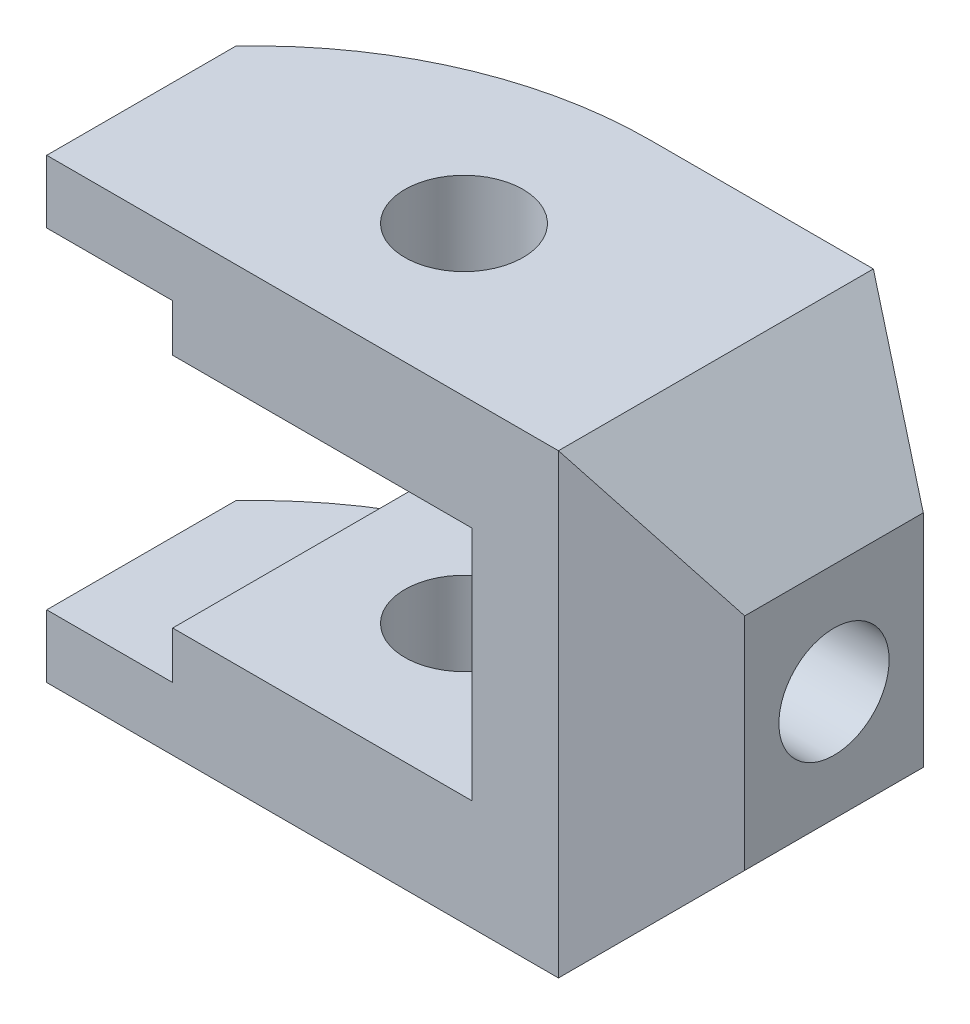
ISO-10303-21;
HEADER;
FILE_DESCRIPTION(('STEP AP214'),'2;1');
FILE_NAME('part.step','',(''),(''),'','','');
FILE_SCHEMA(('AUTOMOTIVE_DESIGN { 1 0 10303 214 1 1 1 1 }'));
ENDSEC;
DATA;
#1=APPLICATION_CONTEXT('core data for automotive mechanical design processes');
#2=APPLICATION_PROTOCOL_DEFINITION('international standard','automotive_design',2000,#1);
#3=PRODUCT_CONTEXT('',#1,'mechanical');
#4=PRODUCT('Part','Part','',(#3));
#5=PRODUCT_RELATED_PRODUCT_CATEGORY('part','',(#4));
#6=PRODUCT_DEFINITION_FORMATION('','',#4);
#7=PRODUCT_DEFINITION_CONTEXT('part definition',#1,'design');
#8=PRODUCT_DEFINITION('design','',#6,#7);
#9=PRODUCT_DEFINITION_SHAPE('','',#8);
#10=(LENGTH_UNIT() NAMED_UNIT(*) SI_UNIT(.MILLI.,.METRE.));
#11=(NAMED_UNIT(*) PLANE_ANGLE_UNIT() SI_UNIT($,.RADIAN.));
#12=(NAMED_UNIT(*) SI_UNIT($,.STERADIAN.) SOLID_ANGLE_UNIT());
#13=UNCERTAINTY_MEASURE_WITH_UNIT(LENGTH_MEASURE(1.E-05),#10,'distance_accuracy_value','');
#14=(GEOMETRIC_REPRESENTATION_CONTEXT(3) GLOBAL_UNCERTAINTY_ASSIGNED_CONTEXT((#13)) GLOBAL_UNIT_ASSIGNED_CONTEXT((#10,
#11,#12)) REPRESENTATION_CONTEXT('',''));
#15=CARTESIAN_POINT('',(0.,0.,0.));
#16=DIRECTION('',(0.,0.,1.));
#17=DIRECTION('',(1.,0.,0.));
#18=AXIS2_PLACEMENT_3D('',#15,#16,#17);
#19=CARTESIAN_POINT('',(0.,58.,0.));
#20=DIRECTION('',(1.,0.,0.));
#21=DIRECTION('',(0.,0.,-1.));
#22=AXIS2_PLACEMENT_3D('',#19,#20,#21);
#23=PLANE('',#22);
#24=DIRECTION('',(0.,-1.,0.));
#25=VECTOR('',#24,1.);
#26=CARTESIAN_POINT('',(0.,58.,-24.));
#27=LINE('',#26,#25);
#28=CARTESIAN_POINT('',(0.,58.,-24.));
#29=VERTEX_POINT('',#28);
#30=CARTESIAN_POINT('',(0.,50.,-24.));
#31=VERTEX_POINT('',#30);
#32=EDGE_CURVE('E208',#29,#31,#27,.T.);
#33=ORIENTED_EDGE('',*,*,#32,.T.);
#34=DIRECTION('',(0.,0.,1.));
#35=VECTOR('',#34,1.);
#36=CARTESIAN_POINT('',(0.,50.,-40.));
#37=LINE('',#36,#35);
#38=CARTESIAN_POINT('',(0.,50.,0.));
#39=VERTEX_POINT('',#38);
#40=EDGE_CURVE('E229',#31,#39,#37,.T.);
#41=ORIENTED_EDGE('',*,*,#40,.T.);
#42=DIRECTION('',(0.,-1.,0.));
#43=VECTOR('',#42,1.);
#44=CARTESIAN_POINT('',(0.,58.,0.));
#45=LINE('',#44,#43);
#46=CARTESIAN_POINT('',(0.,58.,0.));
#47=VERTEX_POINT('',#46);
#48=EDGE_CURVE('E221',#47,#39,#45,.T.);
#49=ORIENTED_EDGE('',*,*,#48,.F.);
#50=DIRECTION('',(0.,0.,1.));
#51=VECTOR('',#50,1.);
#52=CARTESIAN_POINT('',(0.,58.,0.));
#53=LINE('',#52,#51);
#54=EDGE_CURVE('E192',#29,#47,#53,.T.);
#55=ORIENTED_EDGE('',*,*,#54,.F.);
#56=EDGE_LOOP('',(#33,#41,#49,#55));
#57=FACE_BOUND('',#56,.T.);
#58=ADVANCED_FACE('F43',(#57),#23,.F.);
#59=CARTESIAN_POINT('',(36.6606055596467,58.,10.));
#60=DIRECTION('',(0.,-1.,0.));
#61=DIRECTION('',(0.,0.,-1.));
#62=AXIS2_PLACEMENT_3D('',#59,#60,#61);
#63=CYLINDRICAL_SURFACE('',#62,50.);
#64=DIRECTION('',(0.,-1.,0.));
#65=VECTOR('',#64,1.);
#66=CARTESIAN_POINT('',(16.,58.,-35.5317403347236));
#67=LINE('',#66,#65);
#68=CARTESIAN_POINT('',(16.,44.,-35.5317403347236));
#69=VERTEX_POINT('',#68);
#70=CARTESIAN_POINT('',(16.,50.,-35.5317403347236));
#71=VERTEX_POINT('',#70);
#72=EDGE_CURVE('E239',#69,#71,#67,.F.);
#73=ORIENTED_EDGE('',*,*,#72,.T.);
#74=CARTESIAN_POINT('',(36.6606055596467,50.,10.));
#75=DIRECTION('',(0.,1.,0.));
#76=DIRECTION('',(0.,0.,1.));
#77=AXIS2_PLACEMENT_3D('',#74,#75,#76);
#78=CIRCLE('',#77,50.);
#79=EDGE_CURVE('E242',#71,#31,#78,.T.);
#80=ORIENTED_EDGE('',*,*,#79,.T.);
#81=ORIENTED_EDGE('',*,*,#32,.F.);
#82=CARTESIAN_POINT('',(36.6606055596467,58.,10.));
#83=DIRECTION('',(0.,1.,0.));
#84=DIRECTION('',(0.,0.,-1.));
#85=AXIS2_PLACEMENT_3D('',#82,#83,#84);
#86=CIRCLE('',#85,50.);
#87=CARTESIAN_POINT('',(36.6606055596467,58.,-40.));
#88=VERTEX_POINT('',#87);
#89=EDGE_CURVE('E188',#88,#29,#86,.T.);
#90=ORIENTED_EDGE('',*,*,#89,.F.);
#91=DIRECTION('',(0.,-1.,0.));
#92=VECTOR('',#91,1.);
#93=CARTESIAN_POINT('',(36.6606055596467,58.,-40.));
#94=LINE('',#93,#92);
#95=CARTESIAN_POINT('',(36.6606055596467,44.,-40.));
#96=VERTEX_POINT('',#95);
#97=EDGE_CURVE('E181',#88,#96,#94,.T.);
#98=ORIENTED_EDGE('',*,*,#97,.T.);
#99=CARTESIAN_POINT('',(36.6606055596467,44.,10.));
#100=DIRECTION('',(0.,1.,0.));
#101=DIRECTION('',(0.,0.,1.));
#102=AXIS2_PLACEMENT_3D('',#99,#100,#101);
#103=CIRCLE('',#102,50.);
#104=EDGE_CURVE('E233',#96,#69,#103,.T.);
#105=ORIENTED_EDGE('',*,*,#104,.T.);
#106=EDGE_LOOP('',(#73,#80,#81,#90,#98,#105));
#107=FACE_BOUND('',#106,.T.);
#108=ADVANCED_FACE('F247',(#107),#63,.T.);
#109=CARTESIAN_POINT('',(34.,58.,-19.));
#110=DIRECTION('',(0.,-1.,0.));
#111=DIRECTION('',(0.,0.,-1.));
#112=AXIS2_PLACEMENT_3D('',#109,#110,#111);
#113=CYLINDRICAL_SURFACE('',#112,7.5);
#114=CARTESIAN_POINT('',(34.,44.,-19.));
#115=DIRECTION('',(0.,1.,0.));
#116=DIRECTION('',(0.,0.,1.));
#117=AXIS2_PLACEMENT_3D('',#114,#115,#116);
#118=CIRCLE('',#117,7.5);
#119=CARTESIAN_POINT('',(34.,44.,-26.5));
#120=VERTEX_POINT('',#119);
#121=EDGE_CURVE('E230',#120,#120,#118,.T.);
#122=CARTESIAN_POINT('',(34.,58.,-19.));
#123=DIRECTION('',(0.,1.,0.));
#124=DIRECTION('',(0.,0.,1.));
#125=AXIS2_PLACEMENT_3D('',#122,#123,#124);
#126=CIRCLE('',#125,7.5);
#127=CARTESIAN_POINT('',(34.,58.,-26.5));
#128=VERTEX_POINT('',#127);
#129=EDGE_CURVE('E200',#128,#128,#126,.T.);
#130=CARTESIAN_POINT('',(34.,44.,-26.5));
#131=CARTESIAN_POINT('',(34.,44.1458333333333,-26.5));
#132=CARTESIAN_POINT('',(34.,44.2916666666667,-26.5));
#133=CARTESIAN_POINT('',(34.,44.5833333333333,-26.5));
#134=CARTESIAN_POINT('',(34.,44.7291666666667,-26.5));
#135=CARTESIAN_POINT('',(34.,45.0208333333333,-26.5));
#136=CARTESIAN_POINT('',(34.,45.1666666666667,-26.5));
#137=CARTESIAN_POINT('',(34.,45.4583333333333,-26.5));
#138=CARTESIAN_POINT('',(34.,45.6041666666667,-26.5));
#139=CARTESIAN_POINT('',(34.,45.8958333333333,-26.5));
#140=CARTESIAN_POINT('',(34.,46.0416666666667,-26.5));
#141=CARTESIAN_POINT('',(34.,46.3333333333333,-26.5));
#142=CARTESIAN_POINT('',(34.,46.4791666666667,-26.5));
#143=CARTESIAN_POINT('',(34.,46.7708333333333,-26.5));
#144=CARTESIAN_POINT('',(34.,46.9166666666667,-26.5));
#145=CARTESIAN_POINT('',(34.,47.2083333333333,-26.5));
#146=CARTESIAN_POINT('',(34.,47.3541666666667,-26.5));
#147=CARTESIAN_POINT('',(34.,47.6458333333333,-26.5));
#148=CARTESIAN_POINT('',(34.,47.7916666666667,-26.5));
#149=CARTESIAN_POINT('',(34.,48.0833333333333,-26.5));
#150=CARTESIAN_POINT('',(34.,48.2291666666667,-26.5));
#151=CARTESIAN_POINT('',(34.,48.5208333333333,-26.5));
#152=CARTESIAN_POINT('',(34.,48.6666666666667,-26.5));
#153=CARTESIAN_POINT('',(34.,48.9583333333333,-26.5));
#154=CARTESIAN_POINT('',(34.,49.1041666666667,-26.5));
#155=CARTESIAN_POINT('',(34.,49.3958333333333,-26.5));
#156=CARTESIAN_POINT('',(34.,49.5416666666667,-26.5));
#157=CARTESIAN_POINT('',(34.,49.8333333333333,-26.5));
#158=CARTESIAN_POINT('',(34.,49.9791666666667,-26.5));
#159=CARTESIAN_POINT('',(34.,50.2708333333333,-26.5));
#160=CARTESIAN_POINT('',(34.,50.4166666666667,-26.5));
#161=CARTESIAN_POINT('',(34.,50.7083333333333,-26.5));
#162=CARTESIAN_POINT('',(34.,50.8541666666667,-26.5));
#163=CARTESIAN_POINT('',(34.,51.1458333333333,-26.5));
#164=CARTESIAN_POINT('',(34.,51.2916666666667,-26.5));
#165=CARTESIAN_POINT('',(34.,51.5833333333333,-26.5));
#166=CARTESIAN_POINT('',(34.,51.7291666666667,-26.5));
#167=CARTESIAN_POINT('',(34.,52.0208333333333,-26.5));
#168=CARTESIAN_POINT('',(34.,52.1666666666667,-26.5));
#169=CARTESIAN_POINT('',(34.,52.4583333333333,-26.5));
#170=CARTESIAN_POINT('',(34.,52.6041666666667,-26.5));
#171=CARTESIAN_POINT('',(34.,52.8958333333333,-26.5));
#172=CARTESIAN_POINT('',(34.,53.0416666666667,-26.5));
#173=CARTESIAN_POINT('',(34.,53.3333333333333,-26.5));
#174=CARTESIAN_POINT('',(34.,53.4791666666667,-26.5));
#175=CARTESIAN_POINT('',(34.,53.7708333333333,-26.5));
#176=CARTESIAN_POINT('',(34.,53.9166666666667,-26.5));
#177=CARTESIAN_POINT('',(34.,54.2083333333333,-26.5));
#178=CARTESIAN_POINT('',(34.,54.3541666666667,-26.5));
#179=CARTESIAN_POINT('',(34.,54.6458333333333,-26.5));
#180=CARTESIAN_POINT('',(34.,54.7916666666667,-26.5));
#181=CARTESIAN_POINT('',(34.,55.0833333333333,-26.5));
#182=CARTESIAN_POINT('',(34.,55.2291666666667,-26.5));
#183=CARTESIAN_POINT('',(34.,55.5208333333333,-26.5));
#184=CARTESIAN_POINT('',(34.,55.6666666666667,-26.5));
#185=CARTESIAN_POINT('',(34.,55.9583333333333,-26.5));
#186=CARTESIAN_POINT('',(34.,56.1041666666667,-26.5));
#187=CARTESIAN_POINT('',(34.,56.3958333333333,-26.5));
#188=CARTESIAN_POINT('',(34.,56.5416666666667,-26.5));
#189=CARTESIAN_POINT('',(34.,56.8333333333333,-26.5));
#190=CARTESIAN_POINT('',(34.,56.9791666666667,-26.5));
#191=CARTESIAN_POINT('',(34.,57.2708333333333,-26.5));
#192=CARTESIAN_POINT('',(34.,57.4166666666667,-26.5));
#193=CARTESIAN_POINT('',(34.,57.7083333333333,-26.5));
#194=CARTESIAN_POINT('',(34.,57.8541666666667,-26.5));
#195=CARTESIAN_POINT('',(34.,58.,-26.5));
#196=B_SPLINE_CURVE_WITH_KNOTS('',3,(#130,#131,#132,#133,#134,#135,#136,#137,#138,#139,#140,
#141,#142,#143,#144,#145,#146,#147,#148,#149,#150,#151,#152,#153,#154,#155,#156,#157,#158,#159,
#160,#161,#162,#163,#164,#165,#166,#167,#168,#169,#170,#171,#172,#173,#174,#175,#176,#177,#178,
#179,#180,#181,#182,#183,#184,#185,#186,#187,#188,#189,#190,#191,#192,#193,#194,#195),
.UNSPECIFIED.,.F.,.F.,(4,2,2,2,2,2,2,2,2,2,2,2,2,2,2,2,2,2,2,2,2,2,2,2,2,2,2,2,2,2,2,2,4),(0.,
0.4375,0.875000000000001,1.3125,1.74999999999999,2.1875,2.625,3.0625,3.5,3.9375,4.375,4.8125,
5.25,5.6875,6.125,6.5625,7.,7.4375,7.875,8.31249999999999,8.74999999999999,9.18749999999999,
9.62499999999999,10.0625,10.5,10.9375,11.375,11.8125,12.25,12.6875,13.125,13.5625,14.),.UNSPECIFIED.);
#197=EDGE_CURVE('BSEAM337',#120,#128,#196,.T.);
#198=ORIENTED_EDGE('',*,*,#121,.F.);
#199=ORIENTED_EDGE('',*,*,#129,.T.);
#200=ORIENTED_EDGE('',*,*,#197,.T.);
#201=ORIENTED_EDGE('',*,*,#197,.F.);
#202=EDGE_LOOP('',(#198,#200,#199,#201));
#203=FACE_BOUND('',#202,.T.);
#204=ADVANCED_FACE('F337',(#203),#113,.F.);
#205=CARTESIAN_POINT('',(36.6606055596467,58.,10.));
#206=DIRECTION('',(0.,-1.,0.));
#207=DIRECTION('',(0.,0.,-1.));
#208=AXIS2_PLACEMENT_3D('',#205,#206,#207);
#209=PLANE('',#208);
#210=DIRECTION('',(1.,0.,0.));
#211=VECTOR('',#210,1.);
#212=CARTESIAN_POINT('',(0.,58.,0.));
#213=LINE('',#212,#211);
#214=CARTESIAN_POINT('',(65.,58.,0.));
#215=VERTEX_POINT('',#214);
#216=EDGE_CURVE('E169',#47,#215,#213,.T.);
#217=ORIENTED_EDGE('',*,*,#216,.T.);
#218=DIRECTION('',(0.,0.,1.));
#219=VECTOR('',#218,1.);
#220=CARTESIAN_POINT('',(65.,58.,-40.));
#221=LINE('',#220,#219);
#222=CARTESIAN_POINT('',(65.,58.,-40.));
#223=VERTEX_POINT('',#222);
#224=EDGE_CURVE('E155',#223,#215,#221,.T.);
#225=ORIENTED_EDGE('',*,*,#224,.F.);
#226=DIRECTION('',(-1.,0.,0.));
#227=VECTOR('',#226,1.);
#228=CARTESIAN_POINT('',(65.,58.,-40.));
#229=LINE('',#228,#227);
#230=EDGE_CURVE('E166',#223,#88,#229,.T.);
#231=ORIENTED_EDGE('',*,*,#230,.T.);
#232=ORIENTED_EDGE('',*,*,#89,.T.);
#233=ORIENTED_EDGE('',*,*,#54,.T.);
#234=EDGE_LOOP('',(#217,#225,#231,#232,#233));
#235=FACE_BOUND('',#234,.T.);
#236=ORIENTED_EDGE('',*,*,#129,.F.);
#237=EDGE_LOOP('',(#236));
#238=FACE_BOUND('',#237,.T.);
#239=ADVANCED_FACE('F163',(#235,#238),#209,.F.);
#240=CARTESIAN_POINT('',(36.6606055596467,0.,10.));
#241=DIRECTION('',(0.,-1.,0.));
#242=DIRECTION('',(0.,0.,-1.));
#243=AXIS2_PLACEMENT_3D('',#240,#241,#242);
#244=PLANE('',#243);
#245=DIRECTION('',(0.,0.,1.));
#246=VECTOR('',#245,1.);
#247=CARTESIAN_POINT('',(65.,0.,-40.));
#248=LINE('',#247,#246);
#249=CARTESIAN_POINT('',(65.,0.,-40.));
#250=VERTEX_POINT('',#249);
#251=CARTESIAN_POINT('',(65.,0.,0.));
#252=VERTEX_POINT('',#251);
#253=EDGE_CURVE('E171',#250,#252,#248,.T.);
#254=ORIENTED_EDGE('',*,*,#253,.T.);
#255=DIRECTION('',(1.,0.,0.));
#256=VECTOR('',#255,1.);
#257=CARTESIAN_POINT('',(0.,0.,0.));
#258=LINE('',#257,#256);
#259=CARTESIAN_POINT('',(0.,0.,0.));
#260=VERTEX_POINT('',#259);
#261=EDGE_CURVE('E199',#260,#252,#258,.T.);
#262=ORIENTED_EDGE('',*,*,#261,.F.);
#263=DIRECTION('',(0.,0.,1.));
#264=VECTOR('',#263,1.);
#265=CARTESIAN_POINT('',(0.,0.,0.));
#266=LINE('',#265,#264);
#267=CARTESIAN_POINT('',(0.,0.,-24.));
#268=VERTEX_POINT('',#267);
#269=EDGE_CURVE('E196',#268,#260,#266,.T.);
#270=ORIENTED_EDGE('',*,*,#269,.F.);
#271=CARTESIAN_POINT('',(36.6606055596467,0.,10.));
#272=DIRECTION('',(0.,1.,0.));
#273=DIRECTION('',(0.,0.,-1.));
#274=AXIS2_PLACEMENT_3D('',#271,#272,#273);
#275=CIRCLE('',#274,50.);
#276=CARTESIAN_POINT('',(36.6606055596467,0.,-40.));
#277=VERTEX_POINT('',#276);
#278=EDGE_CURVE('E205',#277,#268,#275,.T.);
#279=ORIENTED_EDGE('',*,*,#278,.F.);
#280=DIRECTION('',(-1.,0.,0.));
#281=VECTOR('',#280,1.);
#282=CARTESIAN_POINT('',(65.,0.,-40.));
#283=LINE('',#282,#281);
#284=EDGE_CURVE('E203',#250,#277,#283,.T.);
#285=ORIENTED_EDGE('',*,*,#284,.F.);
#286=EDGE_LOOP('',(#254,#262,#270,#279,#285));
#287=FACE_BOUND('',#286,.T.);
#288=CARTESIAN_POINT('',(34.,0.,-19.));
#289=DIRECTION('',(0.,1.,0.));
#290=DIRECTION('',(0.,0.,1.));
#291=AXIS2_PLACEMENT_3D('',#288,#289,#290);
#292=CIRCLE('',#291,7.5);
#293=CARTESIAN_POINT('',(34.,0.,-26.5));
#294=VERTEX_POINT('',#293);
#295=EDGE_CURVE('E256',#294,#294,#292,.T.);
#296=ORIENTED_EDGE('',*,*,#295,.T.);
#297=EDGE_LOOP('',(#296));
#298=FACE_BOUND('',#297,.T.);
#299=ADVANCED_FACE('F342',(#287,#298),#244,.T.);
#300=CARTESIAN_POINT('',(0.,8.,0.));
#301=VERTEX_POINT('',#300);
#302=EDGE_CURVE('E220',#301,#260,#45,.T.);
#303=ORIENTED_EDGE('',*,*,#302,.F.);
#304=DIRECTION('',(0.,0.,1.));
#305=VECTOR('',#304,1.);
#306=CARTESIAN_POINT('',(0.,8.,-40.));
#307=LINE('',#306,#305);
#308=CARTESIAN_POINT('',(0.,8.,-24.));
#309=VERTEX_POINT('',#308);
#310=EDGE_CURVE('E264',#309,#301,#307,.T.);
#311=ORIENTED_EDGE('',*,*,#310,.F.);
#312=EDGE_CURVE('E190',#309,#268,#27,.T.);
#313=ORIENTED_EDGE('',*,*,#312,.T.);
#314=ORIENTED_EDGE('',*,*,#269,.T.);
#315=EDGE_LOOP('',(#303,#311,#313,#314));
#316=FACE_BOUND('',#315,.T.);
#317=ADVANCED_FACE('F45',(#316),#23,.F.);
#318=CARTESIAN_POINT('',(0.,58.,0.));
#319=DIRECTION('',(0.,0.,-1.));
#320=DIRECTION('',(-1.,0.,0.));
#321=AXIS2_PLACEMENT_3D('',#318,#319,#320);
#322=PLANE('',#321);
#323=ORIENTED_EDGE('',*,*,#48,.T.);
#324=DIRECTION('',(-1.,0.,0.));
#325=VECTOR('',#324,1.);
#326=CARTESIAN_POINT('',(0.,50.,0.));
#327=LINE('',#326,#325);
#328=CARTESIAN_POINT('',(16.,50.,0.));
#329=VERTEX_POINT('',#328);
#330=EDGE_CURVE('E279',#329,#39,#327,.T.);
#331=ORIENTED_EDGE('',*,*,#330,.F.);
#332=DIRECTION('',(0.,1.,0.));
#333=VECTOR('',#332,1.);
#334=CARTESIAN_POINT('',(16.,50.,0.));
#335=LINE('',#334,#333);
#336=CARTESIAN_POINT('',(16.,44.,0.));
#337=VERTEX_POINT('',#336);
#338=EDGE_CURVE('E282',#337,#329,#335,.T.);
#339=ORIENTED_EDGE('',*,*,#338,.F.);
#340=DIRECTION('',(-1.,0.,0.));
#341=VECTOR('',#340,1.);
#342=CARTESIAN_POINT('',(16.,44.,0.));
#343=LINE('',#342,#341);
#344=CARTESIAN_POINT('',(54.,44.,0.));
#345=VERTEX_POINT('',#344);
#346=EDGE_CURVE('E285',#345,#337,#343,.T.);
#347=ORIENTED_EDGE('',*,*,#346,.F.);
#348=DIRECTION('',(0.,1.,0.));
#349=VECTOR('',#348,1.);
#350=CARTESIAN_POINT('',(54.,44.,0.));
#351=LINE('',#350,#349);
#352=CARTESIAN_POINT('',(54.,14.,0.));
#353=VERTEX_POINT('',#352);
#354=EDGE_CURVE('E288',#353,#345,#351,.T.);
#355=ORIENTED_EDGE('',*,*,#354,.F.);
#356=DIRECTION('',(1.,0.,0.));
#357=VECTOR('',#356,1.);
#358=CARTESIAN_POINT('',(54.,14.,0.));
#359=LINE('',#358,#357);
#360=CARTESIAN_POINT('',(16.,14.,0.));
#361=VERTEX_POINT('',#360);
#362=EDGE_CURVE('E291',#361,#353,#359,.T.);
#363=ORIENTED_EDGE('',*,*,#362,.F.);
#364=DIRECTION('',(0.,1.,0.));
#365=VECTOR('',#364,1.);
#366=CARTESIAN_POINT('',(16.,14.,0.));
#367=LINE('',#366,#365);
#368=CARTESIAN_POINT('',(16.,8.,0.));
#369=VERTEX_POINT('',#368);
#370=EDGE_CURVE('E294',#369,#361,#367,.T.);
#371=ORIENTED_EDGE('',*,*,#370,.F.);
#372=DIRECTION('',(1.,0.,0.));
#373=VECTOR('',#372,1.);
#374=CARTESIAN_POINT('',(16.,8.,0.));
#375=LINE('',#374,#373);
#376=EDGE_CURVE('E297',#301,#369,#375,.T.);
#377=ORIENTED_EDGE('',*,*,#376,.F.);
#378=ORIENTED_EDGE('',*,*,#302,.T.);
#379=ORIENTED_EDGE('',*,*,#261,.T.);
#380=DIRECTION('',(0.,-1.,0.));
#381=VECTOR('',#380,1.);
#382=CARTESIAN_POINT('',(65.,58.,0.));
#383=LINE('',#382,#381);
#384=EDGE_CURVE('E217',#215,#252,#383,.T.);
#385=ORIENTED_EDGE('',*,*,#384,.F.);
#386=ORIENTED_EDGE('',*,*,#216,.F.);
#387=EDGE_LOOP('',(#323,#331,#339,#347,#355,#363,#371,#377,#378,#379,#385,#386));
#388=FACE_BOUND('',#387,.T.);
#389=ADVANCED_FACE('F341',(#388),#322,.F.);
#390=CARTESIAN_POINT('',(65.,58.,0.));
#391=DIRECTION('',(-0.500000000000001,0.,-0.866025403784438));
#392=DIRECTION('',(-0.866025403784438,0.,0.500000000000001));
#393=AXIS2_PLACEMENT_3D('',#390,#391,#392);
#394=PLANE('',#393);
#395=DIRECTION('',(0.,-1.,0.));
#396=VECTOR('',#395,1.);
#397=CARTESIAN_POINT('',(80.,58.,-8.66025403784441));
#398=LINE('',#397,#396);
#399=CARTESIAN_POINT('',(80.,43.0000000000002,-8.66025403784441));
#400=VERTEX_POINT('',#399);
#401=CARTESIAN_POINT('',(80.,14.9999999999998,-8.66025403784441));
#402=VERTEX_POINT('',#401);
#403=EDGE_CURVE('E214',#400,#402,#398,.T.);
#404=ORIENTED_EDGE('',*,*,#403,.F.);
#405=DIRECTION('',(-0.65465367070798,0.654653670707973,0.37796447300923));
#406=VECTOR('',#405,1.);
#407=CARTESIAN_POINT('',(65.,58.,0.));
#408=LINE('',#407,#406);
#409=EDGE_CURVE('E299',#400,#215,#408,.T.);
#410=ORIENTED_EDGE('',*,*,#409,.T.);
#411=ORIENTED_EDGE('',*,*,#384,.T.);
#412=DIRECTION('',(0.65465367070798,0.654653670707973,-0.37796447300923));
#413=VECTOR('',#412,1.);
#414=CARTESIAN_POINT('',(89.8571428571428,24.8571428571425,-14.3512781198564));
#415=LINE('',#414,#413);
#416=EDGE_CURVE('E306',#252,#402,#415,.T.);
#417=ORIENTED_EDGE('',*,*,#416,.T.);
#418=EDGE_LOOP('',(#404,#410,#411,#417));
#419=FACE_BOUND('',#418,.T.);
#420=ADVANCED_FACE('F349',(#419),#394,.F.);
#421=CARTESIAN_POINT('',(80.,58.,-8.66025403784441));
#422=DIRECTION('',(-1.,0.,0.));
#423=DIRECTION('',(0.,0.,1.));
#424=AXIS2_PLACEMENT_3D('',#421,#422,#423);
#425=PLANE('',#424);
#426=CARTESIAN_POINT('',(80.,29.,-20.));
#427=DIRECTION('',(1.,0.,0.));
#428=DIRECTION('',(0.,0.,-1.));
#429=AXIS2_PLACEMENT_3D('',#426,#427,#428);
#430=CIRCLE('',#429,7.);
#431=CARTESIAN_POINT('',(80.,29.,-27.));
#432=VERTEX_POINT('',#431);
#433=EDGE_CURVE('E314',#432,#432,#430,.T.);
#434=ORIENTED_EDGE('',*,*,#433,.F.);
#435=EDGE_LOOP('',(#434));
#436=FACE_BOUND('',#435,.T.);
#437=DIRECTION('',(0.,-1.,0.));
#438=VECTOR('',#437,1.);
#439=CARTESIAN_POINT('',(80.,58.,-31.3397459621556));
#440=LINE('',#439,#438);
#441=CARTESIAN_POINT('',(80.,43.0000000000002,-31.3397459621556));
#442=VERTEX_POINT('',#441);
#443=CARTESIAN_POINT('',(80.,14.9999999999998,-31.3397459621556));
#444=VERTEX_POINT('',#443);
#445=EDGE_CURVE('E180',#442,#444,#440,.T.);
#446=ORIENTED_EDGE('',*,*,#445,.F.);
#447=DIRECTION('',(0.,0.,1.));
#448=VECTOR('',#447,1.);
#449=CARTESIAN_POINT('',(80.,43.0000000000002,-40.));
#450=LINE('',#449,#448);
#451=EDGE_CURVE('E59',#442,#400,#450,.T.);
#452=ORIENTED_EDGE('',*,*,#451,.T.);
#453=ORIENTED_EDGE('',*,*,#403,.T.);
#454=DIRECTION('',(0.,0.,1.));
#455=VECTOR('',#454,1.);
#456=CARTESIAN_POINT('',(80.,14.9999999999998,-40.));
#457=LINE('',#456,#455);
#458=EDGE_CURVE('E309',#444,#402,#457,.T.);
#459=ORIENTED_EDGE('',*,*,#458,.F.);
#460=EDGE_LOOP('',(#446,#452,#453,#459));
#461=FACE_BOUND('',#460,.T.);
#462=ADVANCED_FACE('F368',(#436,#461),#425,.F.);
#463=CARTESIAN_POINT('',(80.,58.,-31.3397459621556));
#464=DIRECTION('',(-0.500000000000001,0.,0.866025403784438));
#465=DIRECTION('',(0.866025403784438,0.,0.500000000000001));
#466=AXIS2_PLACEMENT_3D('',#463,#464,#465);
#467=PLANE('',#466);
#468=DIRECTION('',(0.,-1.,0.));
#469=VECTOR('',#468,1.);
#470=CARTESIAN_POINT('',(65.,58.,-40.));
#471=LINE('',#470,#469);
#472=EDGE_CURVE('E175',#223,#250,#471,.T.);
#473=ORIENTED_EDGE('',*,*,#472,.F.);
#474=DIRECTION('',(0.65465367070798,-0.654653670707973,0.37796447300923));
#475=VECTOR('',#474,1.);
#476=CARTESIAN_POINT('',(73.5714285714287,49.4285714285714,-35.051283406946));
#477=LINE('',#476,#475);
#478=EDGE_CURVE('E11',#223,#442,#477,.T.);
#479=ORIENTED_EDGE('',*,*,#478,.T.);
#480=ORIENTED_EDGE('',*,*,#445,.T.);
#481=DIRECTION('',(-0.65465367070798,-0.654653670707973,-0.37796447300923));
#482=VECTOR('',#481,1.);
#483=CARTESIAN_POINT('',(98.4285714285714,33.4285714285711,-20.7000052870896));
#484=LINE('',#483,#482);
#485=EDGE_CURVE('E52',#444,#250,#484,.T.);
#486=ORIENTED_EDGE('',*,*,#485,.T.);
#487=EDGE_LOOP('',(#473,#479,#480,#486));
#488=FACE_BOUND('',#487,.T.);
#489=ADVANCED_FACE('F176',(#488),#467,.F.);
#490=CARTESIAN_POINT('',(65.,58.,-40.));
#491=DIRECTION('',(0.,0.,1.));
#492=DIRECTION('',(1.,0.,0.));
#493=AXIS2_PLACEMENT_3D('',#490,#491,#492);
#494=PLANE('',#493);
#495=DIRECTION('',(0.,1.,0.));
#496=VECTOR('',#495,1.);
#497=CARTESIAN_POINT('',(54.,44.,-40.));
#498=LINE('',#497,#496);
#499=CARTESIAN_POINT('',(54.,14.,-40.));
#500=VERTEX_POINT('',#499);
#501=CARTESIAN_POINT('',(54.,44.,-40.));
#502=VERTEX_POINT('',#501);
#503=EDGE_CURVE('E301',#500,#502,#498,.T.);
#504=ORIENTED_EDGE('',*,*,#503,.T.);
#505=DIRECTION('',(-1.,0.,0.));
#506=VECTOR('',#505,1.);
#507=CARTESIAN_POINT('',(16.,44.,-40.));
#508=LINE('',#507,#506);
#509=EDGE_CURVE('E266',#502,#96,#508,.T.);
#510=ORIENTED_EDGE('',*,*,#509,.T.);
#511=ORIENTED_EDGE('',*,*,#97,.F.);
#512=ORIENTED_EDGE('',*,*,#230,.F.);
#513=ORIENTED_EDGE('',*,*,#472,.T.);
#514=ORIENTED_EDGE('',*,*,#284,.T.);
#515=CARTESIAN_POINT('',(36.6606055596467,14.,-40.));
#516=VERTEX_POINT('',#515);
#517=EDGE_CURVE('E211',#516,#277,#94,.T.);
#518=ORIENTED_EDGE('',*,*,#517,.F.);
#519=DIRECTION('',(1.,0.,0.));
#520=VECTOR('',#519,1.);
#521=CARTESIAN_POINT('',(54.,14.,-40.));
#522=LINE('',#521,#520);
#523=EDGE_CURVE('E281',#516,#500,#522,.T.);
#524=ORIENTED_EDGE('',*,*,#523,.T.);
#525=EDGE_LOOP('',(#504,#510,#511,#512,#513,#514,#518,#524));
#526=FACE_BOUND('',#525,.T.);
#527=ADVANCED_FACE('F184',(#526),#494,.F.);
#528=DIRECTION('',(0.,-1.,0.));
#529=VECTOR('',#528,1.);
#530=CARTESIAN_POINT('',(16.,58.,-35.5317403347236));
#531=LINE('',#530,#529);
#532=CARTESIAN_POINT('',(16.,8.,-35.5317403347236));
#533=VERTEX_POINT('',#532);
#534=CARTESIAN_POINT('',(16.,14.,-35.5317403347236));
#535=VERTEX_POINT('',#534);
#536=EDGE_CURVE('E236',#533,#535,#531,.F.);
#537=ORIENTED_EDGE('',*,*,#536,.T.);
#538=CARTESIAN_POINT('',(36.6606055596467,14.,10.));
#539=DIRECTION('',(0.,-1.,0.));
#540=DIRECTION('',(1.,0.,0.));
#541=AXIS2_PLACEMENT_3D('',#538,#539,#540);
#542=CIRCLE('',#541,50.);
#543=EDGE_CURVE('E228',#535,#516,#542,.T.);
#544=ORIENTED_EDGE('',*,*,#543,.T.);
#545=ORIENTED_EDGE('',*,*,#517,.T.);
#546=ORIENTED_EDGE('',*,*,#278,.T.);
#547=ORIENTED_EDGE('',*,*,#312,.F.);
#548=CARTESIAN_POINT('',(36.6606055596467,8.,10.));
#549=DIRECTION('',(0.,-1.,0.));
#550=DIRECTION('',(0.,0.,-1.));
#551=AXIS2_PLACEMENT_3D('',#548,#549,#550);
#552=CIRCLE('',#551,50.);
#553=EDGE_CURVE('E224',#309,#533,#552,.T.);
#554=ORIENTED_EDGE('',*,*,#553,.T.);
#555=EDGE_LOOP('',(#537,#544,#545,#546,#547,#554));
#556=FACE_BOUND('',#555,.T.);
#557=ADVANCED_FACE('F339',(#556),#63,.T.);
#558=CARTESIAN_POINT('',(34.,14.,-19.));
#559=DIRECTION('',(0.,-1.,0.));
#560=DIRECTION('',(1.,0.,0.));
#561=AXIS2_PLACEMENT_3D('',#558,#559,#560);
#562=CIRCLE('',#561,7.5);
#563=CARTESIAN_POINT('',(34.,14.,-26.5));
#564=VERTEX_POINT('',#563);
#565=EDGE_CURVE('E225',#564,#564,#562,.T.);
#566=CARTESIAN_POINT('',(34.,14.,-26.5));
#567=CARTESIAN_POINT('',(34.,13.8541666666667,-26.5));
#568=CARTESIAN_POINT('',(34.,13.7083333333333,-26.5));
#569=CARTESIAN_POINT('',(34.,13.4166666666667,-26.5));
#570=CARTESIAN_POINT('',(34.,13.2708333333333,-26.5));
#571=CARTESIAN_POINT('',(34.,12.9791666666667,-26.5));
#572=CARTESIAN_POINT('',(34.,12.8333333333333,-26.5));
#573=CARTESIAN_POINT('',(34.,12.5416666666667,-26.5));
#574=CARTESIAN_POINT('',(34.,12.3958333333333,-26.5));
#575=CARTESIAN_POINT('',(34.,12.1041666666667,-26.5));
#576=CARTESIAN_POINT('',(34.,11.9583333333333,-26.5));
#577=CARTESIAN_POINT('',(34.,11.6666666666667,-26.5));
#578=CARTESIAN_POINT('',(34.,11.5208333333333,-26.5));
#579=CARTESIAN_POINT('',(34.,11.2291666666667,-26.5));
#580=CARTESIAN_POINT('',(34.,11.0833333333333,-26.5));
#581=CARTESIAN_POINT('',(34.,10.7916666666667,-26.5));
#582=CARTESIAN_POINT('',(34.,10.6458333333333,-26.5));
#583=CARTESIAN_POINT('',(34.,10.3541666666667,-26.5));
#584=CARTESIAN_POINT('',(34.,10.2083333333333,-26.5));
#585=CARTESIAN_POINT('',(34.,9.91666666666667,-26.5));
#586=CARTESIAN_POINT('',(34.,9.77083333333333,-26.5));
#587=CARTESIAN_POINT('',(34.,9.47916666666667,-26.5));
#588=CARTESIAN_POINT('',(34.,9.33333333333333,-26.5));
#589=CARTESIAN_POINT('',(34.,9.04166666666667,-26.5));
#590=CARTESIAN_POINT('',(34.,8.89583333333333,-26.5));
#591=CARTESIAN_POINT('',(34.,8.60416666666667,-26.5));
#592=CARTESIAN_POINT('',(34.,8.45833333333333,-26.5));
#593=CARTESIAN_POINT('',(34.,8.16666666666667,-26.5));
#594=CARTESIAN_POINT('',(34.,8.02083333333333,-26.5));
#595=CARTESIAN_POINT('',(34.,7.72916666666667,-26.5));
#596=CARTESIAN_POINT('',(34.,7.58333333333333,-26.5));
#597=CARTESIAN_POINT('',(34.,7.29166666666667,-26.5));
#598=CARTESIAN_POINT('',(34.,7.14583333333333,-26.5));
#599=CARTESIAN_POINT('',(34.,6.85416666666667,-26.5));
#600=CARTESIAN_POINT('',(34.,6.70833333333333,-26.5));
#601=CARTESIAN_POINT('',(34.,6.41666666666667,-26.5));
#602=CARTESIAN_POINT('',(34.,6.27083333333333,-26.5));
#603=CARTESIAN_POINT('',(34.,5.97916666666667,-26.5));
#604=CARTESIAN_POINT('',(34.,5.83333333333333,-26.5));
#605=CARTESIAN_POINT('',(34.,5.54166666666666,-26.5));
#606=CARTESIAN_POINT('',(34.,5.39583333333333,-26.5));
#607=CARTESIAN_POINT('',(34.,5.10416666666666,-26.5));
#608=CARTESIAN_POINT('',(34.,4.95833333333333,-26.5));
#609=CARTESIAN_POINT('',(34.,4.66666666666667,-26.5));
#610=CARTESIAN_POINT('',(34.,4.52083333333333,-26.5));
#611=CARTESIAN_POINT('',(34.,4.22916666666667,-26.5));
#612=CARTESIAN_POINT('',(34.,4.08333333333333,-26.5));
#613=CARTESIAN_POINT('',(34.,3.79166666666667,-26.5));
#614=CARTESIAN_POINT('',(34.,3.64583333333333,-26.5));
#615=CARTESIAN_POINT('',(34.,3.35416666666667,-26.5));
#616=CARTESIAN_POINT('',(34.,3.20833333333333,-26.5));
#617=CARTESIAN_POINT('',(34.,2.91666666666666,-26.5));
#618=CARTESIAN_POINT('',(34.,2.77083333333333,-26.5));
#619=CARTESIAN_POINT('',(34.,2.47916666666667,-26.5));
#620=CARTESIAN_POINT('',(34.,2.33333333333334,-26.5));
#621=CARTESIAN_POINT('',(34.,2.04166666666667,-26.5));
#622=CARTESIAN_POINT('',(34.,1.89583333333333,-26.5));
#623=CARTESIAN_POINT('',(34.,1.60416666666667,-26.5));
#624=CARTESIAN_POINT('',(34.,1.45833333333333,-26.5));
#625=CARTESIAN_POINT('',(34.,1.16666666666667,-26.5));
#626=CARTESIAN_POINT('',(34.,1.02083333333333,-26.5));
#627=CARTESIAN_POINT('',(34.,0.729166666666667,-26.5));
#628=CARTESIAN_POINT('',(34.,0.583333333333334,-26.5));
#629=CARTESIAN_POINT('',(34.,0.291666666666667,-26.5));
#630=CARTESIAN_POINT('',(34.,0.145833333333333,-26.5));
#631=CARTESIAN_POINT('',(34.,0.,-26.5));
#632=B_SPLINE_CURVE_WITH_KNOTS('',3,(#566,#567,#568,#569,#570,#571,#572,#573,#574,#575,#576,
#577,#578,#579,#580,#581,#582,#583,#584,#585,#586,#587,#588,#589,#590,#591,#592,#593,#594,#595,
#596,#597,#598,#599,#600,#601,#602,#603,#604,#605,#606,#607,#608,#609,#610,#611,#612,#613,#614,
#615,#616,#617,#618,#619,#620,#621,#622,#623,#624,#625,#626,#627,#628,#629,#630,#631),
.UNSPECIFIED.,.F.,.F.,(4,2,2,2,2,2,2,2,2,2,2,2,2,2,2,2,2,2,2,2,2,2,2,2,2,2,2,2,2,2,2,2,4),(0.,
0.4375,0.875000000000001,1.3125,1.75,2.1875,2.625,3.0625,3.5,3.9375,4.375,4.8125,5.25,5.6875,
6.125,6.5625,7.,7.4375,7.875,8.3125,8.75,9.1875,9.62499999999999,10.0625,10.5,10.9375,11.375,
11.8125,12.25,12.6875,13.125,13.5625,14.),.UNSPECIFIED.);
#633=EDGE_CURVE('BSEAM380',#564,#294,#632,.T.);
#634=ORIENTED_EDGE('',*,*,#565,.F.);
#635=ORIENTED_EDGE('',*,*,#295,.F.);
#636=ORIENTED_EDGE('',*,*,#633,.T.);
#637=ORIENTED_EDGE('',*,*,#633,.F.);
#638=EDGE_LOOP('',(#634,#636,#635,#637));
#639=FACE_BOUND('',#638,.T.);
#640=ADVANCED_FACE('F380',(#639),#113,.F.);
#641=CARTESIAN_POINT('',(0.,50.,-40.));
#642=DIRECTION('',(0.,1.,0.));
#643=DIRECTION('',(0.,0.,1.));
#644=AXIS2_PLACEMENT_3D('',#641,#642,#643);
#645=PLANE('',#644);
#646=DIRECTION('',(0.,0.,1.));
#647=VECTOR('',#646,1.);
#648=CARTESIAN_POINT('',(16.,50.,-40.));
#649=LINE('',#648,#647);
#650=EDGE_CURVE('E276',#71,#329,#649,.T.);
#651=ORIENTED_EDGE('',*,*,#650,.T.);
#652=ORIENTED_EDGE('',*,*,#330,.T.);
#653=ORIENTED_EDGE('',*,*,#40,.F.);
#654=ORIENTED_EDGE('',*,*,#79,.F.);
#655=EDGE_LOOP('',(#651,#652,#653,#654));
#656=FACE_BOUND('',#655,.T.);
#657=ADVANCED_FACE('F387',(#656),#645,.F.);
#658=CARTESIAN_POINT('',(16.,50.,-40.));
#659=DIRECTION('',(1.,0.,0.));
#660=DIRECTION('',(0.,0.,-1.));
#661=AXIS2_PLACEMENT_3D('',#658,#659,#660);
#662=PLANE('',#661);
#663=DIRECTION('',(0.,0.,1.));
#664=VECTOR('',#663,1.);
#665=CARTESIAN_POINT('',(16.,44.,-40.));
#666=LINE('',#665,#664);
#667=EDGE_CURVE('E274',#69,#337,#666,.T.);
#668=ORIENTED_EDGE('',*,*,#667,.T.);
#669=ORIENTED_EDGE('',*,*,#338,.T.);
#670=ORIENTED_EDGE('',*,*,#650,.F.);
#671=ORIENTED_EDGE('',*,*,#72,.F.);
#672=EDGE_LOOP('',(#668,#669,#670,#671));
#673=FACE_BOUND('',#672,.T.);
#674=ADVANCED_FACE('F396',(#673),#662,.F.);
#675=CARTESIAN_POINT('',(16.,14.,-40.));
#676=DIRECTION('',(1.,0.,0.));
#677=DIRECTION('',(0.,0.,-1.));
#678=AXIS2_PLACEMENT_3D('',#675,#676,#677);
#679=PLANE('',#678);
#680=DIRECTION('',(0.,0.,1.));
#681=VECTOR('',#680,1.);
#682=CARTESIAN_POINT('',(16.,8.,-40.));
#683=LINE('',#682,#681);
#684=EDGE_CURVE('E66',#533,#369,#683,.T.);
#685=ORIENTED_EDGE('',*,*,#684,.T.);
#686=ORIENTED_EDGE('',*,*,#370,.T.);
#687=DIRECTION('',(0.,0.,1.));
#688=VECTOR('',#687,1.);
#689=CARTESIAN_POINT('',(16.,14.,-40.));
#690=LINE('',#689,#688);
#691=EDGE_CURVE('E268',#535,#361,#690,.T.);
#692=ORIENTED_EDGE('',*,*,#691,.F.);
#693=ORIENTED_EDGE('',*,*,#536,.F.);
#694=EDGE_LOOP('',(#685,#686,#692,#693));
#695=FACE_BOUND('',#694,.T.);
#696=ADVANCED_FACE('F393',(#695),#679,.F.);
#697=CARTESIAN_POINT('',(16.,8.,-40.));
#698=DIRECTION('',(0.,-1.,0.));
#699=DIRECTION('',(0.,0.,-1.));
#700=AXIS2_PLACEMENT_3D('',#697,#698,#699);
#701=PLANE('',#700);
#702=ORIENTED_EDGE('',*,*,#310,.T.);
#703=ORIENTED_EDGE('',*,*,#376,.T.);
#704=ORIENTED_EDGE('',*,*,#684,.F.);
#705=ORIENTED_EDGE('',*,*,#553,.F.);
#706=EDGE_LOOP('',(#702,#703,#704,#705));
#707=FACE_BOUND('',#706,.T.);
#708=ADVANCED_FACE('F389',(#707),#701,.F.);
#709=CARTESIAN_POINT('',(16.,44.,-40.));
#710=DIRECTION('',(0.,1.,0.));
#711=DIRECTION('',(0.,0.,1.));
#712=AXIS2_PLACEMENT_3D('',#709,#710,#711);
#713=PLANE('',#712);
#714=ORIENTED_EDGE('',*,*,#121,.T.);
#715=EDGE_LOOP('',(#714));
#716=FACE_BOUND('',#715,.T.);
#717=ORIENTED_EDGE('',*,*,#509,.F.);
#718=DIRECTION('',(0.,0.,1.));
#719=VECTOR('',#718,1.);
#720=CARTESIAN_POINT('',(54.,44.,-40.));
#721=LINE('',#720,#719);
#722=EDGE_CURVE('E272',#502,#345,#721,.T.);
#723=ORIENTED_EDGE('',*,*,#722,.T.);
#724=ORIENTED_EDGE('',*,*,#346,.T.);
#725=ORIENTED_EDGE('',*,*,#667,.F.);
#726=ORIENTED_EDGE('',*,*,#104,.F.);
#727=EDGE_LOOP('',(#717,#723,#724,#725,#726));
#728=FACE_BOUND('',#727,.T.);
#729=ADVANCED_FACE('F392',(#716,#728),#713,.F.);
#730=CARTESIAN_POINT('',(54.,14.,-40.));
#731=DIRECTION('',(0.,-1.,0.));
#732=DIRECTION('',(1.,0.,0.));
#733=AXIS2_PLACEMENT_3D('',#730,#731,#732);
#734=PLANE('',#733);
#735=ORIENTED_EDGE('',*,*,#565,.T.);
#736=EDGE_LOOP('',(#735));
#737=FACE_BOUND('',#736,.T.);
#738=ORIENTED_EDGE('',*,*,#691,.T.);
#739=ORIENTED_EDGE('',*,*,#362,.T.);
#740=DIRECTION('',(0.,0.,1.));
#741=VECTOR('',#740,1.);
#742=CARTESIAN_POINT('',(54.,14.,-40.));
#743=LINE('',#742,#741);
#744=EDGE_CURVE('E270',#500,#353,#743,.T.);
#745=ORIENTED_EDGE('',*,*,#744,.F.);
#746=ORIENTED_EDGE('',*,*,#523,.F.);
#747=ORIENTED_EDGE('',*,*,#543,.F.);
#748=EDGE_LOOP('',(#738,#739,#745,#746,#747));
#749=FACE_BOUND('',#748,.T.);
#750=ADVANCED_FACE('F398',(#737,#749),#734,.F.);
#751=CARTESIAN_POINT('',(54.,44.,-40.));
#752=DIRECTION('',(1.,0.,0.));
#753=DIRECTION('',(0.,1.,0.));
#754=AXIS2_PLACEMENT_3D('',#751,#752,#753);
#755=PLANE('',#754);
#756=CARTESIAN_POINT('',(54.,29.,-20.));
#757=DIRECTION('',(1.,0.,0.));
#758=DIRECTION('',(0.,1.,0.));
#759=AXIS2_PLACEMENT_3D('',#756,#757,#758);
#760=CIRCLE('',#759,7.);
#761=CARTESIAN_POINT('',(54.,36.,-20.));
#762=VERTEX_POINT('',#761);
#763=EDGE_CURVE('E47',#762,#762,#760,.T.);
#764=ORIENTED_EDGE('',*,*,#763,.T.);
#765=EDGE_LOOP('',(#764));
#766=FACE_BOUND('',#765,.T.);
#767=ORIENTED_EDGE('',*,*,#354,.T.);
#768=ORIENTED_EDGE('',*,*,#722,.F.);
#769=ORIENTED_EDGE('',*,*,#503,.F.);
#770=ORIENTED_EDGE('',*,*,#744,.T.);
#771=EDGE_LOOP('',(#767,#768,#769,#770));
#772=FACE_BOUND('',#771,.T.);
#773=ADVANCED_FACE('F321',(#766,#772),#755,.F.);
#774=CARTESIAN_POINT('',(80.,14.9999999999998,-40.));
#775=DIRECTION('',(-0.707106781186544,0.707106781186551,0.));
#776=DIRECTION('',(-0.707106781186551,-0.707106781186544,0.));
#777=AXIS2_PLACEMENT_3D('',#774,#775,#776);
#778=PLANE('',#777);
#779=ORIENTED_EDGE('',*,*,#253,.F.);
#780=ORIENTED_EDGE('',*,*,#485,.F.);
#781=ORIENTED_EDGE('',*,*,#458,.T.);
#782=ORIENTED_EDGE('',*,*,#416,.F.);
#783=EDGE_LOOP('',(#779,#780,#781,#782));
#784=FACE_BOUND('',#783,.T.);
#785=ADVANCED_FACE('F331',(#784),#778,.F.);
#786=CARTESIAN_POINT('',(65.,58.,-40.));
#787=DIRECTION('',(-0.707106781186543,-0.707106781186552,0.));
#788=DIRECTION('',(0.707106781186552,-0.707106781186543,0.));
#789=AXIS2_PLACEMENT_3D('',#786,#787,#788);
#790=PLANE('',#789);
#791=ORIENTED_EDGE('',*,*,#451,.F.);
#792=ORIENTED_EDGE('',*,*,#478,.F.);
#793=ORIENTED_EDGE('',*,*,#224,.T.);
#794=ORIENTED_EDGE('',*,*,#409,.F.);
#795=EDGE_LOOP('',(#791,#792,#793,#794));
#796=FACE_BOUND('',#795,.T.);
#797=ADVANCED_FACE('F154',(#796),#790,.F.);
#798=CARTESIAN_POINT('',(0.,29.,-20.));
#799=DIRECTION('',(1.,0.,0.));
#800=DIRECTION('',(0.,0.,-1.));
#801=AXIS2_PLACEMENT_3D('',#798,#799,#800);
#802=CYLINDRICAL_SURFACE('',#801,7.);
#803=ORIENTED_EDGE('',*,*,#433,.T.);
#804=EDGE_LOOP('',(#803));
#805=FACE_BOUND('',#804,.T.);
#806=ORIENTED_EDGE('',*,*,#763,.F.);
#807=EDGE_LOOP('',(#806));
#808=FACE_BOUND('',#807,.T.);
#809=ADVANCED_FACE('F324',(#805,#808),#802,.F.);
#810=CLOSED_SHELL('',(#58,#108,#204,#239,#299,#317,#389,#420,#462,#489,#527,#557,#640,#657,#674,
#696,#708,#729,#750,#773,#785,#797,#809));
#811=MANIFOLD_SOLID_BREP('B2',#810);
#812=ADVANCED_BREP_SHAPE_REPRESENTATION('',(#18,#811),#14);
#813=SHAPE_DEFINITION_REPRESENTATION(#9,#812);
ENDSEC;
END-ISO-10303-21;
